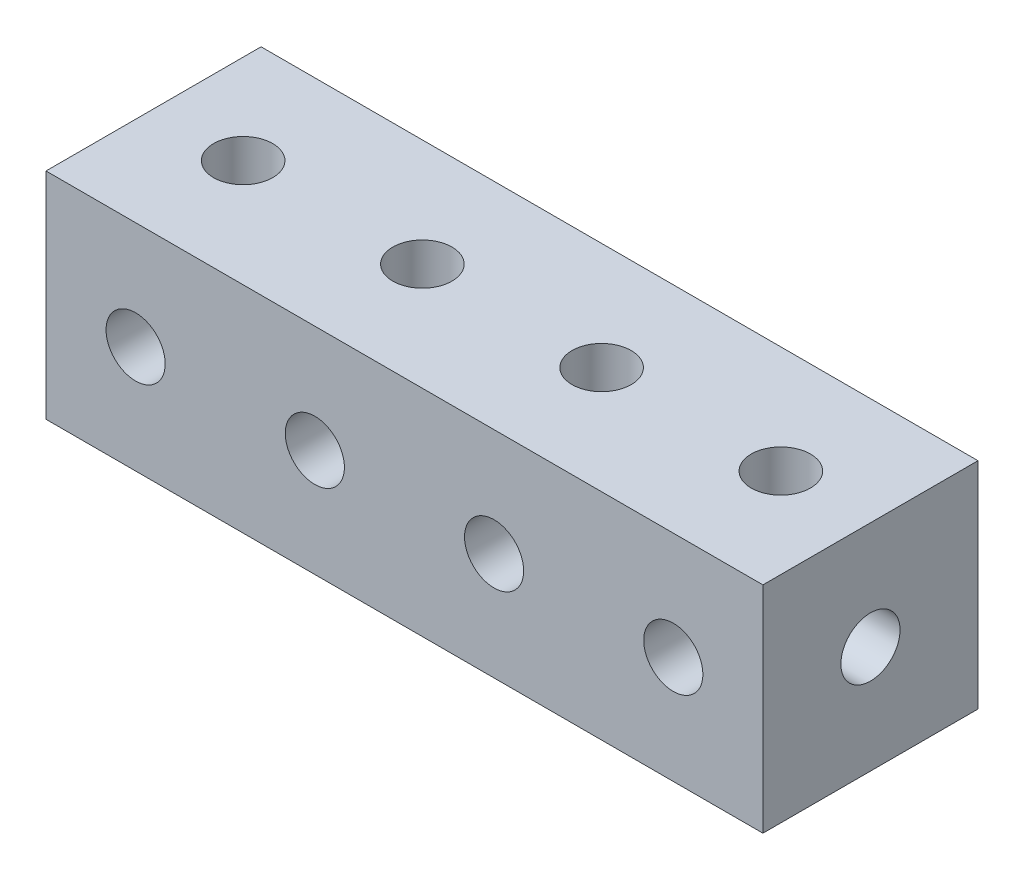
ISO-10303-21;
HEADER;
FILE_DESCRIPTION(('STEP AP214'),'2;1');
FILE_NAME('part.step','',(''),(''),'','','');
FILE_SCHEMA(('AUTOMOTIVE_DESIGN { 1 0 10303 214 1 1 1 1 }'));
ENDSEC;
DATA;
#1=APPLICATION_CONTEXT('core data for automotive mechanical design processes');
#2=APPLICATION_PROTOCOL_DEFINITION('international standard','automotive_design',2000,#1);
#3=PRODUCT_CONTEXT('',#1,'mechanical');
#4=PRODUCT('Part','Part','',(#3));
#5=PRODUCT_RELATED_PRODUCT_CATEGORY('part','',(#4));
#6=PRODUCT_DEFINITION_FORMATION('','',#4);
#7=PRODUCT_DEFINITION_CONTEXT('part definition',#1,'design');
#8=PRODUCT_DEFINITION('design','',#6,#7);
#9=PRODUCT_DEFINITION_SHAPE('','',#8);
#10=(LENGTH_UNIT() NAMED_UNIT(*) SI_UNIT(.MILLI.,.METRE.));
#11=(NAMED_UNIT(*) PLANE_ANGLE_UNIT() SI_UNIT($,.RADIAN.));
#12=(NAMED_UNIT(*) SI_UNIT($,.STERADIAN.) SOLID_ANGLE_UNIT());
#13=UNCERTAINTY_MEASURE_WITH_UNIT(LENGTH_MEASURE(1.E-05),#10,'distance_accuracy_value','');
#14=(GEOMETRIC_REPRESENTATION_CONTEXT(3) GLOBAL_UNCERTAINTY_ASSIGNED_CONTEXT((#13)) GLOBAL_UNIT_ASSIGNED_CONTEXT((#10,
#11,#12)) REPRESENTATION_CONTEXT('',''));
#15=CARTESIAN_POINT('',(0.,0.,0.));
#16=DIRECTION('',(0.,0.,1.));
#17=DIRECTION('',(1.,0.,0.));
#18=AXIS2_PLACEMENT_3D('',#15,#16,#17);
#19=CARTESIAN_POINT('',(35.,0.,-6.));
#20=DIRECTION('',(0.,1.,0.));
#21=DIRECTION('',(0.,0.,1.));
#22=AXIS2_PLACEMENT_3D('',#19,#20,#21);
#23=CYLINDRICAL_SURFACE('',#22,1.65);
#24=CARTESIAN_POINT('',(35.,12.,-6.));
#25=DIRECTION('',(0.,1.,0.));
#26=DIRECTION('',(0.,0.,1.));
#27=AXIS2_PLACEMENT_3D('',#24,#25,#26);
#28=CIRCLE('',#27,1.65);
#29=CARTESIAN_POINT('',(35.,12.,-4.35));
#30=VERTEX_POINT('',#29);
#31=EDGE_CURVE('E272',#30,#30,#28,.T.);
#32=ORIENTED_EDGE('',*,*,#31,.T.);
#33=EDGE_LOOP('',(#32));
#34=FACE_BOUND('',#33,.T.);
#35=CARTESIAN_POINT('',(35.,6.,-6.));
#36=DIRECTION('',(0.,0.707106781186547,-0.707106781186547));
#37=DIRECTION('',(0.,0.707106781186547,0.707106781186547));
#38=AXIS2_PLACEMENT_3D('',#35,#36,#37);
#39=ELLIPSE('',#38,2.33345237791561,1.65);
#40=CARTESIAN_POINT('',(36.1667261889578,7.1667261889578,-4.83327381104219));
#41=VERTEX_POINT('',#40);
#42=CARTESIAN_POINT('',(33.8332738110422,7.1667261889578,-4.83327381104219));
#43=VERTEX_POINT('',#42);
#44=EDGE_CURVE('E186',#41,#43,#39,.F.);
#45=ORIENTED_EDGE('',*,*,#44,.T.);
#46=CARTESIAN_POINT('',(35.,6.,-6.));
#47=DIRECTION('',(0.707106781186547,0.707106781186547,0.));
#48=DIRECTION('',(-0.707106781186547,0.707106781186547,0.));
#49=AXIS2_PLACEMENT_3D('',#46,#47,#48);
#50=ELLIPSE('',#49,2.33345237791561,1.65);
#51=CARTESIAN_POINT('',(33.8332738110422,7.1667261889578,-7.1667261889578));
#52=VERTEX_POINT('',#51);
#53=EDGE_CURVE('E172',#43,#52,#50,.F.);
#54=ORIENTED_EDGE('',*,*,#53,.T.);
#55=CARTESIAN_POINT('',(35.,6.,-6.));
#56=DIRECTION('',(0.,0.707106781186547,0.707106781186547));
#57=DIRECTION('',(0.,0.707106781186547,-0.707106781186547));
#58=AXIS2_PLACEMENT_3D('',#55,#56,#57);
#59=ELLIPSE('',#58,2.33345237791561,1.65);
#60=CARTESIAN_POINT('',(36.1667261889578,7.1667261889578,-7.1667261889578));
#61=VERTEX_POINT('',#60);
#62=EDGE_CURVE('E180',#52,#61,#59,.F.);
#63=ORIENTED_EDGE('',*,*,#62,.T.);
#64=CARTESIAN_POINT('',(35.,6.,-6.));
#65=DIRECTION('',(-0.707106781186547,0.707106781186547,0.));
#66=DIRECTION('',(0.707106781186547,0.707106781186547,0.));
#67=AXIS2_PLACEMENT_3D('',#64,#65,#66);
#68=ELLIPSE('',#67,2.33345237791561,1.65);
#69=EDGE_CURVE('E382',#61,#41,#68,.F.);
#70=ORIENTED_EDGE('',*,*,#69,.T.);
#71=EDGE_LOOP('',(#45,#54,#63,#70));
#72=FACE_BOUND('',#71,.T.);
#73=ADVANCED_FACE('F33',(#34,#72),#23,.F.);
#74=CARTESIAN_POINT('',(25.,0.,-6.));
#75=DIRECTION('',(0.,1.,0.));
#76=DIRECTION('',(0.,0.,1.));
#77=AXIS2_PLACEMENT_3D('',#74,#75,#76);
#78=CYLINDRICAL_SURFACE('',#77,1.65);
#79=CARTESIAN_POINT('',(25.,12.,-6.));
#80=DIRECTION('',(0.,1.,0.));
#81=DIRECTION('',(0.,0.,1.));
#82=AXIS2_PLACEMENT_3D('',#79,#80,#81);
#83=CIRCLE('',#82,1.65);
#84=CARTESIAN_POINT('',(25.,12.,-4.35));
#85=VERTEX_POINT('',#84);
#86=EDGE_CURVE('E279',#85,#85,#83,.T.);
#87=ORIENTED_EDGE('',*,*,#86,.T.);
#88=EDGE_LOOP('',(#87));
#89=FACE_BOUND('',#88,.T.);
#90=CARTESIAN_POINT('',(25.,6.,-6.));
#91=DIRECTION('',(0.,0.707106781186547,-0.707106781186547));
#92=DIRECTION('',(0.,0.707106781186547,0.707106781186547));
#93=AXIS2_PLACEMENT_3D('',#90,#91,#92);
#94=ELLIPSE('',#93,2.33345237791561,1.65);
#95=CARTESIAN_POINT('',(26.1667261889578,7.1667261889578,-4.83327381104219));
#96=VERTEX_POINT('',#95);
#97=CARTESIAN_POINT('',(23.8332738110422,7.1667261889578,-4.83327381104219));
#98=VERTEX_POINT('',#97);
#99=EDGE_CURVE('E208',#96,#98,#94,.F.);
#100=ORIENTED_EDGE('',*,*,#99,.T.);
#101=CARTESIAN_POINT('',(25.,6.,-6.));
#102=DIRECTION('',(0.707106781186547,0.707106781186547,0.));
#103=DIRECTION('',(-0.707106781186547,0.707106781186547,0.));
#104=AXIS2_PLACEMENT_3D('',#101,#102,#103);
#105=ELLIPSE('',#104,2.33345237791561,1.65);
#106=CARTESIAN_POINT('',(23.8332738110422,7.1667261889578,-7.1667261889578));
#107=VERTEX_POINT('',#106);
#108=EDGE_CURVE('E370',#98,#107,#105,.F.);
#109=ORIENTED_EDGE('',*,*,#108,.T.);
#110=CARTESIAN_POINT('',(25.,6.,-6.));
#111=DIRECTION('',(0.,0.707106781186547,0.707106781186547));
#112=DIRECTION('',(0.,0.707106781186547,-0.707106781186547));
#113=AXIS2_PLACEMENT_3D('',#110,#111,#112);
#114=ELLIPSE('',#113,2.33345237791561,1.65);
#115=CARTESIAN_POINT('',(26.1667261889578,7.1667261889578,-7.1667261889578));
#116=VERTEX_POINT('',#115);
#117=EDGE_CURVE('E199',#107,#116,#114,.F.);
#118=ORIENTED_EDGE('',*,*,#117,.T.);
#119=CARTESIAN_POINT('',(25.,6.,-6.));
#120=DIRECTION('',(-0.707106781186547,0.707106781186547,0.));
#121=DIRECTION('',(0.707106781186547,0.707106781186547,0.));
#122=AXIS2_PLACEMENT_3D('',#119,#120,#121);
#123=ELLIPSE('',#122,2.33345237791561,1.65);
#124=EDGE_CURVE('E358',#116,#96,#123,.F.);
#125=ORIENTED_EDGE('',*,*,#124,.T.);
#126=EDGE_LOOP('',(#100,#109,#118,#125));
#127=FACE_BOUND('',#126,.T.);
#128=ADVANCED_FACE('F413',(#89,#127),#78,.F.);
#129=CARTESIAN_POINT('',(15.,0.,-6.));
#130=DIRECTION('',(0.,1.,0.));
#131=DIRECTION('',(0.,0.,1.));
#132=AXIS2_PLACEMENT_3D('',#129,#130,#131);
#133=CYLINDRICAL_SURFACE('',#132,1.65);
#134=CARTESIAN_POINT('',(15.,12.,-6.));
#135=DIRECTION('',(0.,1.,0.));
#136=DIRECTION('',(0.,0.,1.));
#137=AXIS2_PLACEMENT_3D('',#134,#135,#136);
#138=CIRCLE('',#137,1.65);
#139=CARTESIAN_POINT('',(15.,12.,-4.35));
#140=VERTEX_POINT('',#139);
#141=EDGE_CURVE('E285',#140,#140,#138,.T.);
#142=ORIENTED_EDGE('',*,*,#141,.T.);
#143=EDGE_LOOP('',(#142));
#144=FACE_BOUND('',#143,.T.);
#145=CARTESIAN_POINT('',(15.,6.,-6.));
#146=DIRECTION('',(0.,0.707106781186547,-0.707106781186547));
#147=DIRECTION('',(0.,0.707106781186547,0.707106781186547));
#148=AXIS2_PLACEMENT_3D('',#145,#146,#147);
#149=ELLIPSE('',#148,2.3334523779156,1.65);
#150=CARTESIAN_POINT('',(16.1667261889578,7.1667261889578,-4.8332738110422));
#151=VERTEX_POINT('',#150);
#152=CARTESIAN_POINT('',(13.8332738110422,7.1667261889578,-4.8332738110422));
#153=VERTEX_POINT('',#152);
#154=EDGE_CURVE('E220',#151,#153,#149,.F.);
#155=ORIENTED_EDGE('',*,*,#154,.T.);
#156=CARTESIAN_POINT('',(15.,6.,-6.));
#157=DIRECTION('',(0.707106781186547,0.707106781186547,0.));
#158=DIRECTION('',(-0.707106781186547,0.707106781186547,0.));
#159=AXIS2_PLACEMENT_3D('',#156,#157,#158);
#160=ELLIPSE('',#159,2.3334523779156,1.65);
#161=CARTESIAN_POINT('',(13.8332738110422,7.1667261889578,-7.1667261889578));
#162=VERTEX_POINT('',#161);
#163=EDGE_CURVE('E346',#153,#162,#160,.F.);
#164=ORIENTED_EDGE('',*,*,#163,.T.);
#165=CARTESIAN_POINT('',(15.,6.,-6.));
#166=DIRECTION('',(0.,0.707106781186547,0.707106781186547));
#167=DIRECTION('',(0.,0.707106781186547,-0.707106781186547));
#168=AXIS2_PLACEMENT_3D('',#165,#166,#167);
#169=ELLIPSE('',#168,2.3334523779156,1.65);
#170=CARTESIAN_POINT('',(16.1667261889578,7.1667261889578,-7.1667261889578));
#171=VERTEX_POINT('',#170);
#172=EDGE_CURVE('E211',#162,#171,#169,.F.);
#173=ORIENTED_EDGE('',*,*,#172,.T.);
#174=CARTESIAN_POINT('',(15.,6.,-6.));
#175=DIRECTION('',(-0.707106781186547,0.707106781186547,0.));
#176=DIRECTION('',(0.707106781186547,0.707106781186547,0.));
#177=AXIS2_PLACEMENT_3D('',#174,#175,#176);
#178=ELLIPSE('',#177,2.3334523779156,1.65);
#179=EDGE_CURVE('E334',#171,#151,#178,.F.);
#180=ORIENTED_EDGE('',*,*,#179,.T.);
#181=EDGE_LOOP('',(#155,#164,#173,#180));
#182=FACE_BOUND('',#181,.T.);
#183=ADVANCED_FACE('F420',(#144,#182),#133,.F.);
#184=CARTESIAN_POINT('',(5.,0.,-6.));
#185=DIRECTION('',(0.,1.,0.));
#186=DIRECTION('',(0.,0.,1.));
#187=AXIS2_PLACEMENT_3D('',#184,#185,#186);
#188=CYLINDRICAL_SURFACE('',#187,1.65);
#189=CARTESIAN_POINT('',(5.,12.,-6.));
#190=DIRECTION('',(0.,1.,0.));
#191=DIRECTION('',(0.,0.,1.));
#192=AXIS2_PLACEMENT_3D('',#189,#190,#191);
#193=CIRCLE('',#192,1.65);
#194=CARTESIAN_POINT('',(5.,12.,-4.35));
#195=VERTEX_POINT('',#194);
#196=EDGE_CURVE('E266',#195,#195,#193,.T.);
#197=ORIENTED_EDGE('',*,*,#196,.T.);
#198=EDGE_LOOP('',(#197));
#199=FACE_BOUND('',#198,.T.);
#200=CARTESIAN_POINT('',(5.,6.,-6.));
#201=DIRECTION('',(0.,0.707106781186547,-0.707106781186547));
#202=DIRECTION('',(0.,0.707106781186547,0.707106781186547));
#203=AXIS2_PLACEMENT_3D('',#200,#201,#202);
#204=ELLIPSE('',#203,2.33345237791561,1.65);
#205=CARTESIAN_POINT('',(6.1667261889578,7.1667261889578,-4.8332738110422));
#206=VERTEX_POINT('',#205);
#207=CARTESIAN_POINT('',(3.8332738110422,7.1667261889578,-4.8332738110422));
#208=VERTEX_POINT('',#207);
#209=EDGE_CURVE('E232',#206,#208,#204,.F.);
#210=ORIENTED_EDGE('',*,*,#209,.T.);
#211=CARTESIAN_POINT('',(5.,6.,-6.));
#212=DIRECTION('',(0.707106781186547,0.707106781186547,0.));
#213=DIRECTION('',(-0.707106781186547,0.707106781186547,0.));
#214=AXIS2_PLACEMENT_3D('',#211,#212,#213);
#215=ELLIPSE('',#214,2.33345237791561,1.65);
#216=CARTESIAN_POINT('',(3.8332738110422,7.1667261889578,-7.1667261889578));
#217=VERTEX_POINT('',#216);
#218=EDGE_CURVE('E325',#208,#217,#215,.F.);
#219=ORIENTED_EDGE('',*,*,#218,.T.);
#220=CARTESIAN_POINT('',(5.,6.,-6.));
#221=DIRECTION('',(0.,0.707106781186547,0.707106781186547));
#222=DIRECTION('',(0.,0.707106781186547,-0.707106781186547));
#223=AXIS2_PLACEMENT_3D('',#220,#221,#222);
#224=ELLIPSE('',#223,2.33345237791561,1.65);
#225=CARTESIAN_POINT('',(6.1667261889578,7.1667261889578,-7.1667261889578));
#226=VERTEX_POINT('',#225);
#227=EDGE_CURVE('E223',#217,#226,#224,.F.);
#228=ORIENTED_EDGE('',*,*,#227,.T.);
#229=CARTESIAN_POINT('',(5.,6.,-6.));
#230=DIRECTION('',(-0.707106781186547,0.707106781186547,0.));
#231=DIRECTION('',(0.707106781186547,0.707106781186547,0.));
#232=AXIS2_PLACEMENT_3D('',#229,#230,#231);
#233=ELLIPSE('',#232,2.33345237791561,1.65);
#234=EDGE_CURVE('E48',#226,#206,#233,.F.);
#235=ORIENTED_EDGE('',*,*,#234,.T.);
#236=EDGE_LOOP('',(#210,#219,#228,#235));
#237=FACE_BOUND('',#236,.T.);
#238=ADVANCED_FACE('F435',(#199,#237),#188,.F.);
#239=CARTESIAN_POINT('',(40.,0.,0.));
#240=DIRECTION('',(0.,0.,-1.));
#241=DIRECTION('',(0.,1.,0.));
#242=AXIS2_PLACEMENT_3D('',#239,#240,#241);
#243=PLANE('',#242);
#244=CARTESIAN_POINT('',(15.,6.,0.));
#245=DIRECTION('',(0.,0.,1.));
#246=DIRECTION('',(1.,0.,0.));
#247=AXIS2_PLACEMENT_3D('',#244,#245,#246);
#248=CIRCLE('',#247,1.65);
#249=CARTESIAN_POINT('',(16.65,6.,0.));
#250=VERTEX_POINT('',#249);
#251=EDGE_CURVE('E304',#250,#250,#248,.T.);
#252=ORIENTED_EDGE('',*,*,#251,.F.);
#253=EDGE_LOOP('',(#252));
#254=FACE_BOUND('',#253,.T.);
#255=CARTESIAN_POINT('',(25.,6.,0.));
#256=DIRECTION('',(0.,0.,1.));
#257=DIRECTION('',(1.,0.,0.));
#258=AXIS2_PLACEMENT_3D('',#255,#256,#257);
#259=CIRCLE('',#258,1.65);
#260=CARTESIAN_POINT('',(26.65,6.,0.));
#261=VERTEX_POINT('',#260);
#262=EDGE_CURVE('E308',#261,#261,#259,.T.);
#263=ORIENTED_EDGE('',*,*,#262,.F.);
#264=EDGE_LOOP('',(#263));
#265=FACE_BOUND('',#264,.T.);
#266=CARTESIAN_POINT('',(35.,6.,0.));
#267=DIRECTION('',(0.,0.,1.));
#268=DIRECTION('',(1.,0.,0.));
#269=AXIS2_PLACEMENT_3D('',#266,#267,#268);
#270=CIRCLE('',#269,1.65);
#271=CARTESIAN_POINT('',(36.65,6.,0.));
#272=VERTEX_POINT('',#271);
#273=EDGE_CURVE('E305',#272,#272,#270,.T.);
#274=ORIENTED_EDGE('',*,*,#273,.F.);
#275=EDGE_LOOP('',(#274));
#276=FACE_BOUND('',#275,.T.);
#277=CARTESIAN_POINT('',(5.,6.,0.));
#278=DIRECTION('',(0.,0.,1.));
#279=DIRECTION('',(1.,0.,0.));
#280=AXIS2_PLACEMENT_3D('',#277,#278,#279);
#281=CIRCLE('',#280,1.65);
#282=CARTESIAN_POINT('',(6.65,6.,0.));
#283=VERTEX_POINT('',#282);
#284=EDGE_CURVE('E292',#283,#283,#281,.T.);
#285=ORIENTED_EDGE('',*,*,#284,.F.);
#286=EDGE_LOOP('',(#285));
#287=FACE_BOUND('',#286,.T.);
#288=DIRECTION('',(0.,-1.,0.));
#289=VECTOR('',#288,1.);
#290=CARTESIAN_POINT('',(0.,0.,0.));
#291=LINE('',#290,#289);
#292=CARTESIAN_POINT('',(0.,12.,0.));
#293=VERTEX_POINT('',#292);
#294=CARTESIAN_POINT('',(0.,0.,0.));
#295=VERTEX_POINT('',#294);
#296=EDGE_CURVE('E255',#293,#295,#291,.T.);
#297=ORIENTED_EDGE('',*,*,#296,.T.);
#298=DIRECTION('',(-1.,0.,0.));
#299=VECTOR('',#298,1.);
#300=CARTESIAN_POINT('',(40.,0.,0.));
#301=LINE('',#300,#299);
#302=CARTESIAN_POINT('',(40.,0.,0.));
#303=VERTEX_POINT('',#302);
#304=EDGE_CURVE('E235',#303,#295,#301,.T.);
#305=ORIENTED_EDGE('',*,*,#304,.F.);
#306=DIRECTION('',(0.,-1.,0.));
#307=VECTOR('',#306,1.);
#308=CARTESIAN_POINT('',(40.,0.,0.));
#309=LINE('',#308,#307);
#310=CARTESIAN_POINT('',(40.,12.,0.));
#311=VERTEX_POINT('',#310);
#312=EDGE_CURVE('E250',#311,#303,#309,.T.);
#313=ORIENTED_EDGE('',*,*,#312,.F.);
#314=DIRECTION('',(-1.,0.,0.));
#315=VECTOR('',#314,1.);
#316=CARTESIAN_POINT('',(40.,12.,0.));
#317=LINE('',#316,#315);
#318=EDGE_CURVE('E244',#311,#293,#317,.T.);
#319=ORIENTED_EDGE('',*,*,#318,.T.);
#320=EDGE_LOOP('',(#297,#305,#313,#319));
#321=FACE_BOUND('',#320,.T.);
#322=ADVANCED_FACE('F35',(#254,#265,#276,#287,#321),#243,.F.);
#323=CARTESIAN_POINT('',(40.,0.,0.));
#324=DIRECTION('',(0.,1.,0.));
#325=DIRECTION('',(0.,0.,1.));
#326=AXIS2_PLACEMENT_3D('',#323,#324,#325);
#327=PLANE('',#326);
#328=CARTESIAN_POINT('',(15.,0.,-6.));
#329=DIRECTION('',(0.,1.,0.));
#330=DIRECTION('',(0.,0.,1.));
#331=AXIS2_PLACEMENT_3D('',#328,#329,#330);
#332=CIRCLE('',#331,1.65);
#333=CARTESIAN_POINT('',(15.,0.,-4.35));
#334=VERTEX_POINT('',#333);
#335=EDGE_CURVE('E269',#334,#334,#332,.T.);
#336=ORIENTED_EDGE('',*,*,#335,.T.);
#337=EDGE_LOOP('',(#336));
#338=FACE_BOUND('',#337,.T.);
#339=CARTESIAN_POINT('',(25.,0.,-6.));
#340=DIRECTION('',(0.,1.,0.));
#341=DIRECTION('',(0.,0.,1.));
#342=AXIS2_PLACEMENT_3D('',#339,#340,#341);
#343=CIRCLE('',#342,1.65);
#344=CARTESIAN_POINT('',(25.,0.,-4.35));
#345=VERTEX_POINT('',#344);
#346=EDGE_CURVE('E282',#345,#345,#343,.T.);
#347=ORIENTED_EDGE('',*,*,#346,.T.);
#348=EDGE_LOOP('',(#347));
#349=FACE_BOUND('',#348,.T.);
#350=CARTESIAN_POINT('',(35.,0.,-6.));
#351=DIRECTION('',(0.,1.,0.));
#352=DIRECTION('',(0.,0.,1.));
#353=AXIS2_PLACEMENT_3D('',#350,#351,#352);
#354=CIRCLE('',#353,1.65);
#355=CARTESIAN_POINT('',(35.,0.,-4.35));
#356=VERTEX_POINT('',#355);
#357=EDGE_CURVE('E275',#356,#356,#354,.T.);
#358=ORIENTED_EDGE('',*,*,#357,.T.);
#359=EDGE_LOOP('',(#358));
#360=FACE_BOUND('',#359,.T.);
#361=CARTESIAN_POINT('',(5.,0.,-6.));
#362=DIRECTION('',(0.,1.,0.));
#363=DIRECTION('',(0.,0.,1.));
#364=AXIS2_PLACEMENT_3D('',#361,#362,#363);
#365=CIRCLE('',#364,1.65);
#366=CARTESIAN_POINT('',(5.,0.,-4.35));
#367=VERTEX_POINT('',#366);
#368=EDGE_CURVE('E258',#367,#367,#365,.T.);
#369=ORIENTED_EDGE('',*,*,#368,.T.);
#370=EDGE_LOOP('',(#369));
#371=FACE_BOUND('',#370,.T.);
#372=DIRECTION('',(0.,0.,-1.));
#373=VECTOR('',#372,1.);
#374=CARTESIAN_POINT('',(0.,0.,0.));
#375=LINE('',#374,#373);
#376=CARTESIAN_POINT('',(0.,0.,-12.));
#377=VERTEX_POINT('',#376);
#378=EDGE_CURVE('E253',#295,#377,#375,.T.);
#379=ORIENTED_EDGE('',*,*,#378,.T.);
#380=DIRECTION('',(-1.,0.,0.));
#381=VECTOR('',#380,1.);
#382=CARTESIAN_POINT('',(40.,0.,-12.));
#383=LINE('',#382,#381);
#384=CARTESIAN_POINT('',(40.,0.,-12.));
#385=VERTEX_POINT('',#384);
#386=EDGE_CURVE('E238',#385,#377,#383,.T.);
#387=ORIENTED_EDGE('',*,*,#386,.F.);
#388=DIRECTION('',(0.,0.,-1.));
#389=VECTOR('',#388,1.);
#390=CARTESIAN_POINT('',(40.,0.,0.));
#391=LINE('',#390,#389);
#392=EDGE_CURVE('E262',#303,#385,#391,.T.);
#393=ORIENTED_EDGE('',*,*,#392,.F.);
#394=ORIENTED_EDGE('',*,*,#304,.T.);
#395=EDGE_LOOP('',(#379,#387,#393,#394));
#396=FACE_BOUND('',#395,.T.);
#397=ADVANCED_FACE('F440',(#338,#349,#360,#371,#396),#327,.F.);
#398=CARTESIAN_POINT('',(40.,0.,-12.));
#399=DIRECTION('',(0.,0.,1.));
#400=DIRECTION('',(0.,-1.,0.));
#401=AXIS2_PLACEMENT_3D('',#398,#399,#400);
#402=PLANE('',#401);
#403=CARTESIAN_POINT('',(15.,6.,-12.));
#404=DIRECTION('',(0.,0.,1.));
#405=DIRECTION('',(0.,-1.,0.));
#406=AXIS2_PLACEMENT_3D('',#403,#404,#405);
#407=CIRCLE('',#406,1.65);
#408=CARTESIAN_POINT('',(15.,4.35,-12.));
#409=VERTEX_POINT('',#408);
#410=EDGE_CURVE('E301',#409,#409,#407,.T.);
#411=ORIENTED_EDGE('',*,*,#410,.T.);
#412=EDGE_LOOP('',(#411));
#413=FACE_BOUND('',#412,.T.);
#414=CARTESIAN_POINT('',(25.,6.,-12.));
#415=DIRECTION('',(0.,0.,1.));
#416=DIRECTION('',(0.,-1.,0.));
#417=AXIS2_PLACEMENT_3D('',#414,#415,#416);
#418=CIRCLE('',#417,1.65);
#419=CARTESIAN_POINT('',(25.,4.35,-12.));
#420=VERTEX_POINT('',#419);
#421=EDGE_CURVE('E298',#420,#420,#418,.T.);
#422=ORIENTED_EDGE('',*,*,#421,.T.);
#423=EDGE_LOOP('',(#422));
#424=FACE_BOUND('',#423,.T.);
#425=CARTESIAN_POINT('',(35.,6.,-12.));
#426=DIRECTION('',(0.,0.,1.));
#427=DIRECTION('',(0.,-1.,0.));
#428=AXIS2_PLACEMENT_3D('',#425,#426,#427);
#429=CIRCLE('',#428,1.65);
#430=CARTESIAN_POINT('',(35.,4.35,-12.));
#431=VERTEX_POINT('',#430);
#432=EDGE_CURVE('E295',#431,#431,#429,.T.);
#433=ORIENTED_EDGE('',*,*,#432,.T.);
#434=EDGE_LOOP('',(#433));
#435=FACE_BOUND('',#434,.T.);
#436=CARTESIAN_POINT('',(5.,6.,-12.));
#437=DIRECTION('',(0.,0.,1.));
#438=DIRECTION('',(0.,-1.,0.));
#439=AXIS2_PLACEMENT_3D('',#436,#437,#438);
#440=CIRCLE('',#439,1.65);
#441=CARTESIAN_POINT('',(5.,4.35,-12.));
#442=VERTEX_POINT('',#441);
#443=EDGE_CURVE('E276',#442,#442,#440,.T.);
#444=ORIENTED_EDGE('',*,*,#443,.T.);
#445=EDGE_LOOP('',(#444));
#446=FACE_BOUND('',#445,.T.);
#447=DIRECTION('',(0.,1.,0.));
#448=VECTOR('',#447,1.);
#449=CARTESIAN_POINT('',(0.,0.,-12.));
#450=LINE('',#449,#448);
#451=CARTESIAN_POINT('',(0.,12.,-12.));
#452=VERTEX_POINT('',#451);
#453=EDGE_CURVE('E251',#377,#452,#450,.T.);
#454=ORIENTED_EDGE('',*,*,#453,.T.);
#455=DIRECTION('',(-1.,0.,0.));
#456=VECTOR('',#455,1.);
#457=CARTESIAN_POINT('',(40.,12.,-12.));
#458=LINE('',#457,#456);
#459=CARTESIAN_POINT('',(40.,12.,-12.));
#460=VERTEX_POINT('',#459);
#461=EDGE_CURVE('E241',#460,#452,#458,.T.);
#462=ORIENTED_EDGE('',*,*,#461,.F.);
#463=DIRECTION('',(0.,1.,0.));
#464=VECTOR('',#463,1.);
#465=CARTESIAN_POINT('',(40.,0.,-12.));
#466=LINE('',#465,#464);
#467=EDGE_CURVE('E260',#385,#460,#466,.T.);
#468=ORIENTED_EDGE('',*,*,#467,.F.);
#469=ORIENTED_EDGE('',*,*,#386,.T.);
#470=EDGE_LOOP('',(#454,#462,#468,#469));
#471=FACE_BOUND('',#470,.T.);
#472=ADVANCED_FACE('F443',(#413,#424,#435,#446,#471),#402,.F.);
#473=CARTESIAN_POINT('',(40.,12.,0.));
#474=DIRECTION('',(0.,-1.,0.));
#475=DIRECTION('',(0.,0.,-1.));
#476=AXIS2_PLACEMENT_3D('',#473,#474,#475);
#477=PLANE('',#476);
#478=ORIENTED_EDGE('',*,*,#141,.F.);
#479=EDGE_LOOP('',(#478));
#480=FACE_BOUND('',#479,.T.);
#481=ORIENTED_EDGE('',*,*,#86,.F.);
#482=EDGE_LOOP('',(#481));
#483=FACE_BOUND('',#482,.T.);
#484=ORIENTED_EDGE('',*,*,#31,.F.);
#485=EDGE_LOOP('',(#484));
#486=FACE_BOUND('',#485,.T.);
#487=ORIENTED_EDGE('',*,*,#196,.F.);
#488=EDGE_LOOP('',(#487));
#489=FACE_BOUND('',#488,.T.);
#490=DIRECTION('',(0.,0.,1.));
#491=VECTOR('',#490,1.);
#492=CARTESIAN_POINT('',(0.,12.,0.));
#493=LINE('',#492,#491);
#494=EDGE_CURVE('E248',#452,#293,#493,.T.);
#495=ORIENTED_EDGE('',*,*,#494,.T.);
#496=ORIENTED_EDGE('',*,*,#318,.F.);
#497=DIRECTION('',(0.,0.,1.));
#498=VECTOR('',#497,1.);
#499=CARTESIAN_POINT('',(40.,12.,0.));
#500=LINE('',#499,#498);
#501=EDGE_CURVE('E247',#460,#311,#500,.T.);
#502=ORIENTED_EDGE('',*,*,#501,.F.);
#503=ORIENTED_EDGE('',*,*,#461,.T.);
#504=EDGE_LOOP('',(#495,#496,#502,#503));
#505=FACE_BOUND('',#504,.T.);
#506=ADVANCED_FACE('F457',(#480,#483,#486,#489,#505),#477,.F.);
#507=CARTESIAN_POINT('',(40.,0.,0.));
#508=DIRECTION('',(-1.,0.,0.));
#509=DIRECTION('',(0.,0.,1.));
#510=AXIS2_PLACEMENT_3D('',#507,#508,#509);
#511=PLANE('',#510);
#512=CARTESIAN_POINT('',(40.,6.,-6.));
#513=DIRECTION('',(1.,0.,0.));
#514=DIRECTION('',(0.,0.,-1.));
#515=AXIS2_PLACEMENT_3D('',#512,#513,#514);
#516=CIRCLE('',#515,1.65);
#517=CARTESIAN_POINT('',(40.,6.,-7.65));
#518=VERTEX_POINT('',#517);
#519=EDGE_CURVE('E390',#518,#518,#516,.T.);
#520=ORIENTED_EDGE('',*,*,#519,.F.);
#521=EDGE_LOOP('',(#520));
#522=FACE_BOUND('',#521,.T.);
#523=ORIENTED_EDGE('',*,*,#312,.T.);
#524=ORIENTED_EDGE('',*,*,#392,.T.);
#525=ORIENTED_EDGE('',*,*,#467,.T.);
#526=ORIENTED_EDGE('',*,*,#501,.T.);
#527=EDGE_LOOP('',(#523,#524,#525,#526));
#528=FACE_BOUND('',#527,.T.);
#529=ADVANCED_FACE('F462',(#522,#528),#511,.F.);
#530=CARTESIAN_POINT('',(0.,0.,0.));
#531=DIRECTION('',(-1.,0.,0.));
#532=DIRECTION('',(0.,0.,1.));
#533=AXIS2_PLACEMENT_3D('',#530,#531,#532);
#534=PLANE('',#533);
#535=CARTESIAN_POINT('',(0.,6.,-6.));
#536=DIRECTION('',(1.,0.,0.));
#537=DIRECTION('',(0.,0.,-1.));
#538=AXIS2_PLACEMENT_3D('',#535,#536,#537);
#539=CIRCLE('',#538,1.65);
#540=CARTESIAN_POINT('',(0.,6.,-7.65));
#541=VERTEX_POINT('',#540);
#542=EDGE_CURVE('E389',#541,#541,#539,.T.);
#543=ORIENTED_EDGE('',*,*,#542,.T.);
#544=EDGE_LOOP('',(#543));
#545=FACE_BOUND('',#544,.T.);
#546=ORIENTED_EDGE('',*,*,#296,.F.);
#547=ORIENTED_EDGE('',*,*,#494,.F.);
#548=ORIENTED_EDGE('',*,*,#453,.F.);
#549=ORIENTED_EDGE('',*,*,#378,.F.);
#550=EDGE_LOOP('',(#546,#547,#548,#549));
#551=FACE_BOUND('',#550,.T.);
#552=ADVANCED_FACE('F396',(#545,#551),#534,.T.);
#553=CARTESIAN_POINT('',(5.,6.,-6.));
#554=DIRECTION('',(0.,0.707106781186547,0.707106781186547));
#555=DIRECTION('',(0.,0.707106781186547,-0.707106781186547));
#556=AXIS2_PLACEMENT_3D('',#553,#554,#555);
#557=ELLIPSE('',#556,2.33345237791561,1.65);
#558=CARTESIAN_POINT('',(3.8332738110422,4.8332738110422,-4.8332738110422));
#559=VERTEX_POINT('',#558);
#560=CARTESIAN_POINT('',(6.1667261889578,4.8332738110422,-4.8332738110422));
#561=VERTEX_POINT('',#560);
#562=EDGE_CURVE('E226',#559,#561,#557,.T.);
#563=ORIENTED_EDGE('',*,*,#562,.T.);
#564=CARTESIAN_POINT('',(5.,6.,-6.));
#565=DIRECTION('',(0.707106781186547,0.707106781186547,0.));
#566=DIRECTION('',(-0.707106781186547,0.707106781186547,0.));
#567=AXIS2_PLACEMENT_3D('',#564,#565,#566);
#568=ELLIPSE('',#567,2.33345237791561,1.65);
#569=CARTESIAN_POINT('',(6.1667261889578,4.8332738110422,-7.1667261889578));
#570=VERTEX_POINT('',#569);
#571=EDGE_CURVE('E317',#561,#570,#568,.T.);
#572=ORIENTED_EDGE('',*,*,#571,.T.);
#573=CARTESIAN_POINT('',(5.,6.,-6.));
#574=DIRECTION('',(0.,0.707106781186547,-0.707106781186547));
#575=DIRECTION('',(0.,0.707106781186547,0.707106781186547));
#576=AXIS2_PLACEMENT_3D('',#573,#574,#575);
#577=ELLIPSE('',#576,2.33345237791561,1.65);
#578=CARTESIAN_POINT('',(3.8332738110422,4.8332738110422,-7.1667261889578));
#579=VERTEX_POINT('',#578);
#580=EDGE_CURVE('E229',#570,#579,#577,.T.);
#581=ORIENTED_EDGE('',*,*,#580,.T.);
#582=CARTESIAN_POINT('',(5.,6.,-6.));
#583=DIRECTION('',(-0.707106781186547,0.707106781186547,0.));
#584=DIRECTION('',(0.707106781186547,0.707106781186547,0.));
#585=AXIS2_PLACEMENT_3D('',#582,#583,#584);
#586=ELLIPSE('',#585,2.33345237791561,1.65);
#587=EDGE_CURVE('E56',#579,#559,#586,.T.);
#588=ORIENTED_EDGE('',*,*,#587,.T.);
#589=EDGE_LOOP('',(#563,#572,#581,#588));
#590=FACE_BOUND('',#589,.T.);
#591=ORIENTED_EDGE('',*,*,#368,.F.);
#592=EDGE_LOOP('',(#591));
#593=FACE_BOUND('',#592,.T.);
#594=ADVANCED_FACE('F426',(#590,#593),#188,.F.);
#595=CARTESIAN_POINT('',(35.,6.,-6.));
#596=DIRECTION('',(0.,0.707106781186547,0.707106781186547));
#597=DIRECTION('',(0.,0.707106781186547,-0.707106781186547));
#598=AXIS2_PLACEMENT_3D('',#595,#596,#597);
#599=ELLIPSE('',#598,2.33345237791561,1.65);
#600=CARTESIAN_POINT('',(33.8332738110422,4.8332738110422,-4.83327381104219));
#601=VERTEX_POINT('',#600);
#602=CARTESIAN_POINT('',(36.1667261889578,4.8332738110422,-4.83327381104219));
#603=VERTEX_POINT('',#602);
#604=EDGE_CURVE('E191',#601,#603,#599,.T.);
#605=ORIENTED_EDGE('',*,*,#604,.T.);
#606=CARTESIAN_POINT('',(35.,6.,-6.));
#607=DIRECTION('',(0.707106781186547,0.707106781186547,0.));
#608=DIRECTION('',(-0.707106781186547,0.707106781186547,0.));
#609=AXIS2_PLACEMENT_3D('',#606,#607,#608);
#610=ELLIPSE('',#609,2.33345237791561,1.65);
#611=CARTESIAN_POINT('',(36.1667261889578,4.8332738110422,-7.1667261889578));
#612=VERTEX_POINT('',#611);
#613=EDGE_CURVE('E384',#603,#612,#610,.T.);
#614=ORIENTED_EDGE('',*,*,#613,.T.);
#615=CARTESIAN_POINT('',(35.,6.,-6.));
#616=DIRECTION('',(0.,0.707106781186547,-0.707106781186547));
#617=DIRECTION('',(0.,0.707106781186547,0.707106781186547));
#618=AXIS2_PLACEMENT_3D('',#615,#616,#617);
#619=ELLIPSE('',#618,2.33345237791561,1.65);
#620=CARTESIAN_POINT('',(33.8332738110422,4.8332738110422,-7.1667261889578));
#621=VERTEX_POINT('',#620);
#622=EDGE_CURVE('E194',#612,#621,#619,.T.);
#623=ORIENTED_EDGE('',*,*,#622,.T.);
#624=CARTESIAN_POINT('',(35.,6.,-6.));
#625=DIRECTION('',(-0.707106781186547,0.707106781186547,0.));
#626=DIRECTION('',(0.707106781186547,0.707106781186547,0.));
#627=AXIS2_PLACEMENT_3D('',#624,#625,#626);
#628=ELLIPSE('',#627,2.33345237791561,1.65);
#629=EDGE_CURVE('E175',#621,#601,#628,.T.);
#630=ORIENTED_EDGE('',*,*,#629,.T.);
#631=EDGE_LOOP('',(#605,#614,#623,#630));
#632=FACE_BOUND('',#631,.T.);
#633=ORIENTED_EDGE('',*,*,#357,.F.);
#634=EDGE_LOOP('',(#633));
#635=FACE_BOUND('',#634,.T.);
#636=ADVANCED_FACE('F416',(#632,#635),#23,.F.);
#637=CARTESIAN_POINT('',(25.,6.,-6.));
#638=DIRECTION('',(0.,0.707106781186547,0.707106781186547));
#639=DIRECTION('',(0.,0.707106781186547,-0.707106781186547));
#640=AXIS2_PLACEMENT_3D('',#637,#638,#639);
#641=ELLIPSE('',#640,2.33345237791561,1.65);
#642=CARTESIAN_POINT('',(23.8332738110422,4.8332738110422,-4.83327381104219));
#643=VERTEX_POINT('',#642);
#644=CARTESIAN_POINT('',(26.1667261889578,4.8332738110422,-4.83327381104219));
#645=VERTEX_POINT('',#644);
#646=EDGE_CURVE('E202',#643,#645,#641,.T.);
#647=ORIENTED_EDGE('',*,*,#646,.T.);
#648=CARTESIAN_POINT('',(25.,6.,-6.));
#649=DIRECTION('',(0.707106781186547,0.707106781186547,0.));
#650=DIRECTION('',(-0.707106781186547,0.707106781186547,0.));
#651=AXIS2_PLACEMENT_3D('',#648,#649,#650);
#652=ELLIPSE('',#651,2.33345237791561,1.65);
#653=CARTESIAN_POINT('',(26.1667261889578,4.8332738110422,-7.1667261889578));
#654=VERTEX_POINT('',#653);
#655=EDGE_CURVE('E361',#645,#654,#652,.T.);
#656=ORIENTED_EDGE('',*,*,#655,.T.);
#657=CARTESIAN_POINT('',(25.,6.,-6.));
#658=DIRECTION('',(0.,0.707106781186547,-0.707106781186547));
#659=DIRECTION('',(0.,0.707106781186547,0.707106781186547));
#660=AXIS2_PLACEMENT_3D('',#657,#658,#659);
#661=ELLIPSE('',#660,2.33345237791561,1.65);
#662=CARTESIAN_POINT('',(23.8332738110422,4.8332738110422,-7.1667261889578));
#663=VERTEX_POINT('',#662);
#664=EDGE_CURVE('E205',#654,#663,#661,.T.);
#665=ORIENTED_EDGE('',*,*,#664,.T.);
#666=CARTESIAN_POINT('',(25.,6.,-6.));
#667=DIRECTION('',(-0.707106781186547,0.707106781186547,0.));
#668=DIRECTION('',(0.707106781186547,0.707106781186547,0.));
#669=AXIS2_PLACEMENT_3D('',#666,#667,#668);
#670=ELLIPSE('',#669,2.33345237791561,1.65);
#671=EDGE_CURVE('E373',#663,#643,#670,.T.);
#672=ORIENTED_EDGE('',*,*,#671,.T.);
#673=EDGE_LOOP('',(#647,#656,#665,#672));
#674=FACE_BOUND('',#673,.T.);
#675=ORIENTED_EDGE('',*,*,#346,.F.);
#676=EDGE_LOOP('',(#675));
#677=FACE_BOUND('',#676,.T.);
#678=ADVANCED_FACE('F423',(#674,#677),#78,.F.);
#679=CARTESIAN_POINT('',(15.,6.,-6.));
#680=DIRECTION('',(0.,0.707106781186547,0.707106781186547));
#681=DIRECTION('',(0.,0.707106781186547,-0.707106781186547));
#682=AXIS2_PLACEMENT_3D('',#679,#680,#681);
#683=ELLIPSE('',#682,2.3334523779156,1.65);
#684=CARTESIAN_POINT('',(13.8332738110422,4.8332738110422,-4.8332738110422));
#685=VERTEX_POINT('',#684);
#686=CARTESIAN_POINT('',(16.1667261889578,4.8332738110422,-4.8332738110422));
#687=VERTEX_POINT('',#686);
#688=EDGE_CURVE('E214',#685,#687,#683,.T.);
#689=ORIENTED_EDGE('',*,*,#688,.T.);
#690=CARTESIAN_POINT('',(15.,6.,-6.));
#691=DIRECTION('',(0.707106781186547,0.707106781186547,0.));
#692=DIRECTION('',(-0.707106781186547,0.707106781186547,0.));
#693=AXIS2_PLACEMENT_3D('',#690,#691,#692);
#694=ELLIPSE('',#693,2.3334523779156,1.65);
#695=CARTESIAN_POINT('',(16.1667261889578,4.8332738110422,-7.1667261889578));
#696=VERTEX_POINT('',#695);
#697=EDGE_CURVE('E337',#687,#696,#694,.T.);
#698=ORIENTED_EDGE('',*,*,#697,.T.);
#699=CARTESIAN_POINT('',(15.,6.,-6.));
#700=DIRECTION('',(0.,0.707106781186547,-0.707106781186547));
#701=DIRECTION('',(0.,0.707106781186547,0.707106781186547));
#702=AXIS2_PLACEMENT_3D('',#699,#700,#701);
#703=ELLIPSE('',#702,2.3334523779156,1.65);
#704=CARTESIAN_POINT('',(13.8332738110422,4.8332738110422,-7.1667261889578));
#705=VERTEX_POINT('',#704);
#706=EDGE_CURVE('E217',#696,#705,#703,.T.);
#707=ORIENTED_EDGE('',*,*,#706,.T.);
#708=CARTESIAN_POINT('',(15.,6.,-6.));
#709=DIRECTION('',(-0.707106781186547,0.707106781186547,0.));
#710=DIRECTION('',(0.707106781186547,0.707106781186547,0.));
#711=AXIS2_PLACEMENT_3D('',#708,#709,#710);
#712=ELLIPSE('',#711,2.3334523779156,1.65);
#713=EDGE_CURVE('E349',#705,#685,#712,.T.);
#714=ORIENTED_EDGE('',*,*,#713,.T.);
#715=EDGE_LOOP('',(#689,#698,#707,#714));
#716=FACE_BOUND('',#715,.T.);
#717=ORIENTED_EDGE('',*,*,#335,.F.);
#718=EDGE_LOOP('',(#717));
#719=FACE_BOUND('',#718,.T.);
#720=ADVANCED_FACE('F432',(#716,#719),#133,.F.);
#721=CARTESIAN_POINT('',(5.,6.,-40.));
#722=DIRECTION('',(0.,0.,1.));
#723=DIRECTION('',(1.,0.,0.));
#724=AXIS2_PLACEMENT_3D('',#721,#722,#723);
#725=CYLINDRICAL_SURFACE('',#724,1.65);
#726=ORIENTED_EDGE('',*,*,#284,.T.);
#727=EDGE_LOOP('',(#726));
#728=FACE_BOUND('',#727,.T.);
#729=ORIENTED_EDGE('',*,*,#562,.F.);
#730=CARTESIAN_POINT('',(5.,6.,-6.));
#731=DIRECTION('',(0.707106781186547,0.,0.707106781186547));
#732=DIRECTION('',(-0.707106781186547,0.,0.707106781186547));
#733=AXIS2_PLACEMENT_3D('',#730,#731,#732);
#734=ELLIPSE('',#733,2.33345237791561,1.65);
#735=EDGE_CURVE('E322',#559,#208,#734,.F.);
#736=ORIENTED_EDGE('',*,*,#735,.T.);
#737=ORIENTED_EDGE('',*,*,#209,.F.);
#738=CARTESIAN_POINT('',(5.,6.,-6.));
#739=DIRECTION('',(-0.707106781186547,0.,0.707106781186547));
#740=DIRECTION('',(0.707106781186547,0.,0.707106781186547));
#741=AXIS2_PLACEMENT_3D('',#738,#739,#740);
#742=ELLIPSE('',#741,2.33345237791561,1.65);
#743=EDGE_CURVE('E309',#206,#561,#742,.F.);
#744=ORIENTED_EDGE('',*,*,#743,.T.);
#745=EDGE_LOOP('',(#729,#736,#737,#744));
#746=FACE_BOUND('',#745,.T.);
#747=ADVANCED_FACE('F490',(#728,#746),#725,.F.);
#748=ORIENTED_EDGE('',*,*,#580,.F.);
#749=CARTESIAN_POINT('',(5.,6.,-6.));
#750=DIRECTION('',(0.707106781186547,0.,0.707106781186547));
#751=DIRECTION('',(-0.707106781186547,0.,0.707106781186547));
#752=AXIS2_PLACEMENT_3D('',#749,#750,#751);
#753=ELLIPSE('',#752,2.33345237791561,1.65);
#754=EDGE_CURVE('E320',#570,#226,#753,.T.);
#755=ORIENTED_EDGE('',*,*,#754,.T.);
#756=ORIENTED_EDGE('',*,*,#227,.F.);
#757=CARTESIAN_POINT('',(5.,6.,-6.));
#758=DIRECTION('',(-0.707106781186547,0.,0.707106781186547));
#759=DIRECTION('',(0.707106781186547,0.,0.707106781186547));
#760=AXIS2_PLACEMENT_3D('',#757,#758,#759);
#761=ELLIPSE('',#760,2.33345237791561,1.65);
#762=EDGE_CURVE('E329',#217,#579,#761,.T.);
#763=ORIENTED_EDGE('',*,*,#762,.T.);
#764=EDGE_LOOP('',(#748,#755,#756,#763));
#765=FACE_BOUND('',#764,.T.);
#766=ORIENTED_EDGE('',*,*,#443,.F.);
#767=EDGE_LOOP('',(#766));
#768=FACE_BOUND('',#767,.T.);
#769=ADVANCED_FACE('F487',(#765,#768),#725,.F.);
#770=CARTESIAN_POINT('',(15.,6.,-40.));
#771=DIRECTION('',(0.,0.,1.));
#772=DIRECTION('',(1.,0.,0.));
#773=AXIS2_PLACEMENT_3D('',#770,#771,#772);
#774=CYLINDRICAL_SURFACE('',#773,1.65);
#775=ORIENTED_EDGE('',*,*,#251,.T.);
#776=EDGE_LOOP('',(#775));
#777=FACE_BOUND('',#776,.T.);
#778=ORIENTED_EDGE('',*,*,#688,.F.);
#779=CARTESIAN_POINT('',(15.,6.,-6.));
#780=DIRECTION('',(0.707106781186547,0.,0.707106781186547));
#781=DIRECTION('',(-0.707106781186547,0.,0.707106781186547));
#782=AXIS2_PLACEMENT_3D('',#779,#780,#781);
#783=ELLIPSE('',#782,2.33345237791561,1.65);
#784=EDGE_CURVE('E343',#685,#153,#783,.F.);
#785=ORIENTED_EDGE('',*,*,#784,.T.);
#786=ORIENTED_EDGE('',*,*,#154,.F.);
#787=CARTESIAN_POINT('',(15.,6.,-6.));
#788=DIRECTION('',(-0.707106781186547,0.,0.707106781186547));
#789=DIRECTION('',(0.707106781186547,0.,0.707106781186547));
#790=AXIS2_PLACEMENT_3D('',#787,#788,#789);
#791=ELLIPSE('',#790,2.33345237791561,1.65);
#792=EDGE_CURVE('E331',#151,#687,#791,.F.);
#793=ORIENTED_EDGE('',*,*,#792,.T.);
#794=EDGE_LOOP('',(#778,#785,#786,#793));
#795=FACE_BOUND('',#794,.T.);
#796=ADVANCED_FACE('F489',(#777,#795),#774,.F.);
#797=ORIENTED_EDGE('',*,*,#706,.F.);
#798=CARTESIAN_POINT('',(15.,6.,-6.));
#799=DIRECTION('',(0.707106781186547,0.,0.707106781186547));
#800=DIRECTION('',(-0.707106781186547,0.,0.707106781186547));
#801=AXIS2_PLACEMENT_3D('',#798,#799,#800);
#802=ELLIPSE('',#801,2.33345237791561,1.65);
#803=EDGE_CURVE('E340',#696,#171,#802,.T.);
#804=ORIENTED_EDGE('',*,*,#803,.T.);
#805=ORIENTED_EDGE('',*,*,#172,.F.);
#806=CARTESIAN_POINT('',(15.,6.,-6.));
#807=DIRECTION('',(-0.707106781186547,0.,0.707106781186547));
#808=DIRECTION('',(0.707106781186547,0.,0.707106781186547));
#809=AXIS2_PLACEMENT_3D('',#806,#807,#808);
#810=ELLIPSE('',#809,2.33345237791561,1.65);
#811=EDGE_CURVE('E352',#162,#705,#810,.T.);
#812=ORIENTED_EDGE('',*,*,#811,.T.);
#813=EDGE_LOOP('',(#797,#804,#805,#812));
#814=FACE_BOUND('',#813,.T.);
#815=ORIENTED_EDGE('',*,*,#410,.F.);
#816=EDGE_LOOP('',(#815));
#817=FACE_BOUND('',#816,.T.);
#818=ADVANCED_FACE('F497',(#814,#817),#774,.F.);
#819=CARTESIAN_POINT('',(25.,6.,-40.));
#820=DIRECTION('',(0.,0.,1.));
#821=DIRECTION('',(1.,0.,0.));
#822=AXIS2_PLACEMENT_3D('',#819,#820,#821);
#823=CYLINDRICAL_SURFACE('',#822,1.65);
#824=ORIENTED_EDGE('',*,*,#262,.T.);
#825=EDGE_LOOP('',(#824));
#826=FACE_BOUND('',#825,.T.);
#827=ORIENTED_EDGE('',*,*,#646,.F.);
#828=CARTESIAN_POINT('',(25.,6.,-6.));
#829=DIRECTION('',(0.707106781186547,0.,0.707106781186547));
#830=DIRECTION('',(-0.707106781186547,0.,0.707106781186547));
#831=AXIS2_PLACEMENT_3D('',#828,#829,#830);
#832=ELLIPSE('',#831,2.33345237791561,1.65);
#833=EDGE_CURVE('E367',#643,#98,#832,.F.);
#834=ORIENTED_EDGE('',*,*,#833,.T.);
#835=ORIENTED_EDGE('',*,*,#99,.F.);
#836=CARTESIAN_POINT('',(25.,6.,-6.));
#837=DIRECTION('',(-0.707106781186547,0.,0.707106781186547));
#838=DIRECTION('',(0.707106781186547,0.,0.707106781186547));
#839=AXIS2_PLACEMENT_3D('',#836,#837,#838);
#840=ELLIPSE('',#839,2.33345237791561,1.65);
#841=EDGE_CURVE('E355',#96,#645,#840,.F.);
#842=ORIENTED_EDGE('',*,*,#841,.T.);
#843=EDGE_LOOP('',(#827,#834,#835,#842));
#844=FACE_BOUND('',#843,.T.);
#845=ADVANCED_FACE('F526',(#826,#844),#823,.F.);
#846=ORIENTED_EDGE('',*,*,#664,.F.);
#847=CARTESIAN_POINT('',(25.,6.,-6.));
#848=DIRECTION('',(0.707106781186547,0.,0.707106781186547));
#849=DIRECTION('',(-0.707106781186547,0.,0.707106781186547));
#850=AXIS2_PLACEMENT_3D('',#847,#848,#849);
#851=ELLIPSE('',#850,2.33345237791561,1.65);
#852=EDGE_CURVE('E364',#654,#116,#851,.T.);
#853=ORIENTED_EDGE('',*,*,#852,.T.);
#854=ORIENTED_EDGE('',*,*,#117,.F.);
#855=CARTESIAN_POINT('',(25.,6.,-6.));
#856=DIRECTION('',(-0.707106781186547,0.,0.707106781186547));
#857=DIRECTION('',(0.707106781186547,0.,0.707106781186547));
#858=AXIS2_PLACEMENT_3D('',#855,#856,#857);
#859=ELLIPSE('',#858,2.33345237791561,1.65);
#860=EDGE_CURVE('E376',#107,#663,#859,.T.);
#861=ORIENTED_EDGE('',*,*,#860,.T.);
#862=EDGE_LOOP('',(#846,#853,#854,#861));
#863=FACE_BOUND('',#862,.T.);
#864=ORIENTED_EDGE('',*,*,#421,.F.);
#865=EDGE_LOOP('',(#864));
#866=FACE_BOUND('',#865,.T.);
#867=ADVANCED_FACE('F530',(#863,#866),#823,.F.);
#868=CARTESIAN_POINT('',(35.,6.,-40.));
#869=DIRECTION('',(0.,0.,1.));
#870=DIRECTION('',(1.,0.,0.));
#871=AXIS2_PLACEMENT_3D('',#868,#869,#870);
#872=CYLINDRICAL_SURFACE('',#871,1.65);
#873=ORIENTED_EDGE('',*,*,#273,.T.);
#874=EDGE_LOOP('',(#873));
#875=FACE_BOUND('',#874,.T.);
#876=ORIENTED_EDGE('',*,*,#604,.F.);
#877=CARTESIAN_POINT('',(35.,6.,-6.));
#878=DIRECTION('',(0.707106781186547,0.,0.707106781186547));
#879=DIRECTION('',(-0.707106781186547,0.,0.707106781186547));
#880=AXIS2_PLACEMENT_3D('',#877,#878,#879);
#881=ELLIPSE('',#880,2.33345237791561,1.65);
#882=EDGE_CURVE('E187',#601,#43,#881,.F.);
#883=ORIENTED_EDGE('',*,*,#882,.T.);
#884=ORIENTED_EDGE('',*,*,#44,.F.);
#885=CARTESIAN_POINT('',(35.,6.,-6.));
#886=DIRECTION('',(-0.707106781186547,0.,0.707106781186547));
#887=DIRECTION('',(0.707106781186547,0.,0.707106781186547));
#888=AXIS2_PLACEMENT_3D('',#885,#886,#887);
#889=ELLIPSE('',#888,2.33345237791561,1.65);
#890=EDGE_CURVE('E379',#41,#603,#889,.F.);
#891=ORIENTED_EDGE('',*,*,#890,.T.);
#892=EDGE_LOOP('',(#876,#883,#884,#891));
#893=FACE_BOUND('',#892,.T.);
#894=ADVANCED_FACE('F533',(#875,#893),#872,.F.);
#895=ORIENTED_EDGE('',*,*,#622,.F.);
#896=CARTESIAN_POINT('',(35.,6.,-6.));
#897=DIRECTION('',(0.707106781186547,0.,0.707106781186547));
#898=DIRECTION('',(-0.707106781186547,0.,0.707106781186547));
#899=AXIS2_PLACEMENT_3D('',#896,#897,#898);
#900=ELLIPSE('',#899,2.33345237791561,1.65);
#901=EDGE_CURVE('E11',#612,#61,#900,.T.);
#902=ORIENTED_EDGE('',*,*,#901,.T.);
#903=ORIENTED_EDGE('',*,*,#62,.F.);
#904=CARTESIAN_POINT('',(35.,6.,-6.));
#905=DIRECTION('',(-0.707106781186547,0.,0.707106781186547));
#906=DIRECTION('',(0.707106781186547,0.,0.707106781186547));
#907=AXIS2_PLACEMENT_3D('',#904,#905,#906);
#908=ELLIPSE('',#907,2.33345237791561,1.65);
#909=EDGE_CURVE('E41',#52,#621,#908,.T.);
#910=ORIENTED_EDGE('',*,*,#909,.T.);
#911=EDGE_LOOP('',(#895,#902,#903,#910));
#912=FACE_BOUND('',#911,.T.);
#913=ORIENTED_EDGE('',*,*,#432,.F.);
#914=EDGE_LOOP('',(#913));
#915=FACE_BOUND('',#914,.T.);
#916=ADVANCED_FACE('F189',(#912,#915),#872,.F.);
#917=CARTESIAN_POINT('',(0.,6.,-6.));
#918=DIRECTION('',(1.,0.,0.));
#919=DIRECTION('',(0.,0.,-1.));
#920=AXIS2_PLACEMENT_3D('',#917,#918,#919);
#921=CYLINDRICAL_SURFACE('',#920,1.65);
#922=ORIENTED_EDGE('',*,*,#629,.F.);
#923=ORIENTED_EDGE('',*,*,#909,.F.);
#924=ORIENTED_EDGE('',*,*,#53,.F.);
#925=ORIENTED_EDGE('',*,*,#882,.F.);
#926=EDGE_LOOP('',(#922,#923,#924,#925));
#927=FACE_BOUND('',#926,.T.);
#928=ORIENTED_EDGE('',*,*,#124,.F.);
#929=ORIENTED_EDGE('',*,*,#852,.F.);
#930=ORIENTED_EDGE('',*,*,#655,.F.);
#931=ORIENTED_EDGE('',*,*,#841,.F.);
#932=EDGE_LOOP('',(#928,#929,#930,#931));
#933=FACE_BOUND('',#932,.T.);
#934=ADVANCED_FACE('F170',(#927,#933),#921,.F.);
#935=ORIENTED_EDGE('',*,*,#519,.T.);
#936=EDGE_LOOP('',(#935));
#937=FACE_BOUND('',#936,.T.);
#938=ORIENTED_EDGE('',*,*,#69,.F.);
#939=ORIENTED_EDGE('',*,*,#901,.F.);
#940=ORIENTED_EDGE('',*,*,#613,.F.);
#941=ORIENTED_EDGE('',*,*,#890,.F.);
#942=EDGE_LOOP('',(#938,#939,#940,#941));
#943=FACE_BOUND('',#942,.T.);
#944=ADVANCED_FACE('F408',(#937,#943),#921,.F.);
#945=ORIENTED_EDGE('',*,*,#671,.F.);
#946=ORIENTED_EDGE('',*,*,#860,.F.);
#947=ORIENTED_EDGE('',*,*,#108,.F.);
#948=ORIENTED_EDGE('',*,*,#833,.F.);
#949=EDGE_LOOP('',(#945,#946,#947,#948));
#950=FACE_BOUND('',#949,.T.);
#951=ORIENTED_EDGE('',*,*,#179,.F.);
#952=ORIENTED_EDGE('',*,*,#803,.F.);
#953=ORIENTED_EDGE('',*,*,#697,.F.);
#954=ORIENTED_EDGE('',*,*,#792,.F.);
#955=EDGE_LOOP('',(#951,#952,#953,#954));
#956=FACE_BOUND('',#955,.T.);
#957=ADVANCED_FACE('F403',(#950,#956),#921,.F.);
#958=ORIENTED_EDGE('',*,*,#713,.F.);
#959=ORIENTED_EDGE('',*,*,#811,.F.);
#960=ORIENTED_EDGE('',*,*,#163,.F.);
#961=ORIENTED_EDGE('',*,*,#784,.F.);
#962=EDGE_LOOP('',(#958,#959,#960,#961));
#963=FACE_BOUND('',#962,.T.);
#964=ORIENTED_EDGE('',*,*,#234,.F.);
#965=ORIENTED_EDGE('',*,*,#754,.F.);
#966=ORIENTED_EDGE('',*,*,#571,.F.);
#967=ORIENTED_EDGE('',*,*,#743,.F.);
#968=EDGE_LOOP('',(#964,#965,#966,#967));
#969=FACE_BOUND('',#968,.T.);
#970=ADVANCED_FACE('F401',(#963,#969),#921,.F.);
#971=ORIENTED_EDGE('',*,*,#542,.F.);
#972=EDGE_LOOP('',(#971));
#973=FACE_BOUND('',#972,.T.);
#974=ORIENTED_EDGE('',*,*,#587,.F.);
#975=ORIENTED_EDGE('',*,*,#762,.F.);
#976=ORIENTED_EDGE('',*,*,#218,.F.);
#977=ORIENTED_EDGE('',*,*,#735,.F.);
#978=EDGE_LOOP('',(#974,#975,#976,#977));
#979=FACE_BOUND('',#978,.T.);
#980=ADVANCED_FACE('F399',(#973,#979),#921,.F.);
#981=CLOSED_SHELL('',(#73,#128,#183,#238,#322,#397,#472,#506,#529,#552,#594,#636,#678,#720,#747,
#769,#796,#818,#845,#867,#894,#916,#934,#944,#957,#970,#980));
#982=MANIFOLD_SOLID_BREP('B2',#981);
#983=ADVANCED_BREP_SHAPE_REPRESENTATION('',(#18,#982),#14);
#984=SHAPE_DEFINITION_REPRESENTATION(#9,#983);
ENDSEC;
END-ISO-10303-21;
